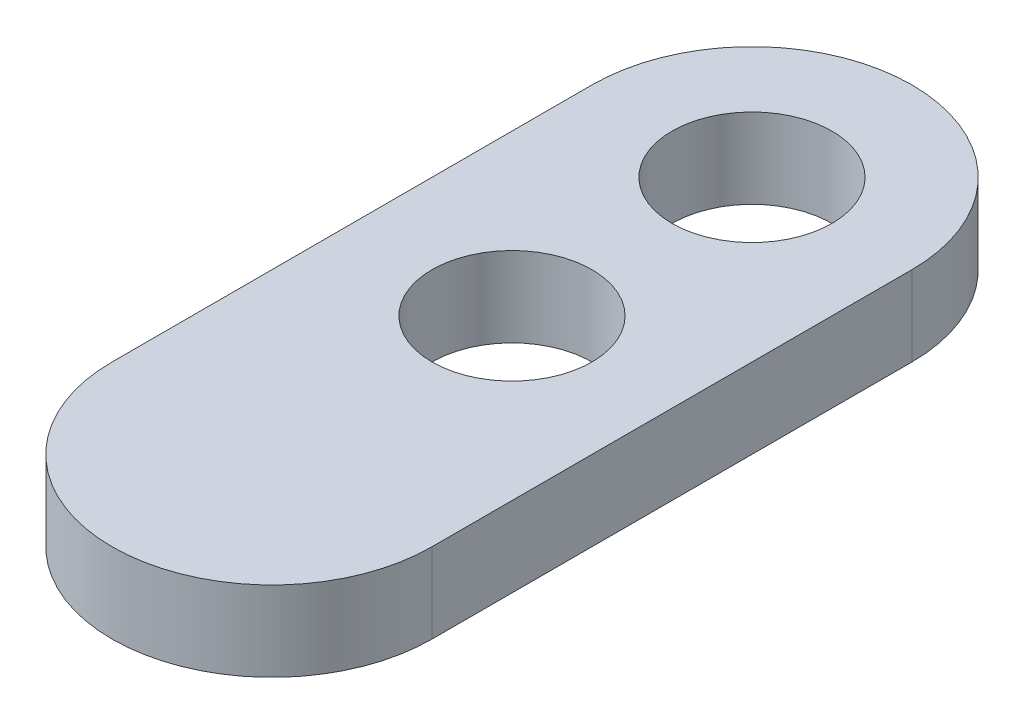
ISO-10303-21;
HEADER;
FILE_DESCRIPTION(('STEP AP214'),'2;1');
FILE_NAME('part.step','',(''),(''),'','','');
FILE_SCHEMA(('AUTOMOTIVE_DESIGN { 1 0 10303 214 1 1 1 1 }'));
ENDSEC;
DATA;
#1=APPLICATION_CONTEXT('core data for automotive mechanical design processes');
#2=APPLICATION_PROTOCOL_DEFINITION('international standard','automotive_design',2000,#1);
#3=PRODUCT_CONTEXT('',#1,'mechanical');
#4=PRODUCT('Part','Part','',(#3));
#5=PRODUCT_RELATED_PRODUCT_CATEGORY('part','',(#4));
#6=PRODUCT_DEFINITION_FORMATION('','',#4);
#7=PRODUCT_DEFINITION_CONTEXT('part definition',#1,'design');
#8=PRODUCT_DEFINITION('design','',#6,#7);
#9=PRODUCT_DEFINITION_SHAPE('','',#8);
#10=(LENGTH_UNIT() NAMED_UNIT(*) SI_UNIT(.MILLI.,.METRE.));
#11=(NAMED_UNIT(*) PLANE_ANGLE_UNIT() SI_UNIT($,.RADIAN.));
#12=(NAMED_UNIT(*) SI_UNIT($,.STERADIAN.) SOLID_ANGLE_UNIT());
#13=UNCERTAINTY_MEASURE_WITH_UNIT(LENGTH_MEASURE(1.E-05),#10,'distance_accuracy_value','');
#14=(GEOMETRIC_REPRESENTATION_CONTEXT(3) GLOBAL_UNCERTAINTY_ASSIGNED_CONTEXT((#13)) GLOBAL_UNIT_ASSIGNED_CONTEXT((#10,
#11,#12)) REPRESENTATION_CONTEXT('',''));
#15=CARTESIAN_POINT('',(0.,0.,0.));
#16=DIRECTION('',(0.,0.,1.));
#17=DIRECTION('',(1.,0.,0.));
#18=AXIS2_PLACEMENT_3D('',#15,#16,#17);
#19=CARTESIAN_POINT('',(0.,2.5,-7.5));
#20=DIRECTION('',(0.,-1.,0.));
#21=DIRECTION('',(0.,0.,-1.));
#22=AXIS2_PLACEMENT_3D('',#19,#20,#21);
#23=CYLINDRICAL_SURFACE('',#22,5.);
#24=CARTESIAN_POINT('',(0.,0.,-7.5));
#25=DIRECTION('',(0.,1.,0.));
#26=DIRECTION('',(0.,0.,1.));
#27=AXIS2_PLACEMENT_3D('',#24,#25,#26);
#28=CIRCLE('',#27,5.);
#29=CARTESIAN_POINT('',(-5.,0.,-7.5));
#30=VERTEX_POINT('',#29);
#31=CARTESIAN_POINT('',(5.,0.,-7.5));
#32=VERTEX_POINT('',#31);
#33=EDGE_CURVE('E99',#30,#32,#28,.F.);
#34=ORIENTED_EDGE('',*,*,#33,.F.);
#35=DIRECTION('',(0.,-1.,0.));
#36=VECTOR('',#35,1.);
#37=CARTESIAN_POINT('',(-5.,2.5,-7.5));
#38=LINE('',#37,#36);
#39=CARTESIAN_POINT('',(-5.,2.5,-7.5));
#40=VERTEX_POINT('',#39);
#41=EDGE_CURVE('E11',#40,#30,#38,.T.);
#42=ORIENTED_EDGE('',*,*,#41,.F.);
#43=CARTESIAN_POINT('',(0.,2.5,-7.5));
#44=DIRECTION('',(0.,1.,0.));
#45=DIRECTION('',(0.,0.,1.));
#46=AXIS2_PLACEMENT_3D('',#43,#44,#45);
#47=CIRCLE('',#46,5.);
#48=CARTESIAN_POINT('',(5.,2.5,-7.5));
#49=VERTEX_POINT('',#48);
#50=EDGE_CURVE('E92',#40,#49,#47,.F.);
#51=ORIENTED_EDGE('',*,*,#50,.T.);
#52=DIRECTION('',(0.,-1.,0.));
#53=VECTOR('',#52,1.);
#54=CARTESIAN_POINT('',(5.,2.5,-7.5));
#55=LINE('',#54,#53);
#56=EDGE_CURVE('E73',#49,#32,#55,.T.);
#57=ORIENTED_EDGE('',*,*,#56,.T.);
#58=EDGE_LOOP('',(#34,#42,#51,#57));
#59=FACE_BOUND('',#58,.T.);
#60=ADVANCED_FACE('F35',(#59),#23,.T.);
#61=CARTESIAN_POINT('',(-5.,2.5,0.));
#62=DIRECTION('',(-1.,0.,0.));
#63=DIRECTION('',(0.,0.,1.));
#64=AXIS2_PLACEMENT_3D('',#61,#62,#63);
#65=PLANE('',#64);
#66=DIRECTION('',(0.,0.,-1.));
#67=VECTOR('',#66,1.);
#68=CARTESIAN_POINT('',(-5.,0.,0.));
#69=LINE('',#68,#67);
#70=CARTESIAN_POINT('',(-5.,0.,7.5));
#71=VERTEX_POINT('',#70);
#72=EDGE_CURVE('E86',#71,#30,#69,.T.);
#73=ORIENTED_EDGE('',*,*,#72,.F.);
#74=DIRECTION('',(0.,-1.,0.));
#75=VECTOR('',#74,1.);
#76=CARTESIAN_POINT('',(-5.,2.5,7.5));
#77=LINE('',#76,#75);
#78=CARTESIAN_POINT('',(-5.,2.5,7.5));
#79=VERTEX_POINT('',#78);
#80=EDGE_CURVE('E43',#79,#71,#77,.T.);
#81=ORIENTED_EDGE('',*,*,#80,.F.);
#82=DIRECTION('',(0.,0.,-1.));
#83=VECTOR('',#82,1.);
#84=CARTESIAN_POINT('',(-5.,2.5,0.));
#85=LINE('',#84,#83);
#86=EDGE_CURVE('E84',#79,#40,#85,.T.);
#87=ORIENTED_EDGE('',*,*,#86,.T.);
#88=ORIENTED_EDGE('',*,*,#41,.T.);
#89=EDGE_LOOP('',(#73,#81,#87,#88));
#90=FACE_BOUND('',#89,.T.);
#91=ADVANCED_FACE('F82',(#90),#65,.T.);
#92=CARTESIAN_POINT('',(0.,2.5,7.5));
#93=DIRECTION('',(0.,-1.,0.));
#94=DIRECTION('',(0.,0.,-1.));
#95=AXIS2_PLACEMENT_3D('',#92,#93,#94);
#96=CYLINDRICAL_SURFACE('',#95,5.);
#97=CARTESIAN_POINT('',(0.,0.,7.5));
#98=DIRECTION('',(0.,1.,0.));
#99=DIRECTION('',(0.,0.,1.));
#100=AXIS2_PLACEMENT_3D('',#97,#98,#99);
#101=CIRCLE('',#100,5.);
#102=CARTESIAN_POINT('',(5.,0.,7.5));
#103=VERTEX_POINT('',#102);
#104=EDGE_CURVE('E66',#71,#103,#101,.T.);
#105=ORIENTED_EDGE('',*,*,#104,.T.);
#106=DIRECTION('',(0.,-1.,0.));
#107=VECTOR('',#106,1.);
#108=CARTESIAN_POINT('',(5.,2.5,7.5));
#109=LINE('',#108,#107);
#110=CARTESIAN_POINT('',(5.,2.5,7.5));
#111=VERTEX_POINT('',#110);
#112=EDGE_CURVE('E87',#111,#103,#109,.T.);
#113=ORIENTED_EDGE('',*,*,#112,.F.);
#114=CARTESIAN_POINT('',(0.,2.5,7.5));
#115=DIRECTION('',(0.,1.,0.));
#116=DIRECTION('',(0.,0.,1.));
#117=AXIS2_PLACEMENT_3D('',#114,#115,#116);
#118=CIRCLE('',#117,5.);
#119=EDGE_CURVE('E88',#79,#111,#118,.T.);
#120=ORIENTED_EDGE('',*,*,#119,.F.);
#121=ORIENTED_EDGE('',*,*,#80,.T.);
#122=EDGE_LOOP('',(#105,#113,#120,#121));
#123=FACE_BOUND('',#122,.T.);
#124=ADVANCED_FACE('F89',(#123),#96,.T.);
#125=CARTESIAN_POINT('',(5.,2.5,0.));
#126=DIRECTION('',(-1.,0.,0.));
#127=DIRECTION('',(0.,0.,1.));
#128=AXIS2_PLACEMENT_3D('',#125,#126,#127);
#129=PLANE('',#128);
#130=DIRECTION('',(0.,0.,-1.));
#131=VECTOR('',#130,1.);
#132=CARTESIAN_POINT('',(5.,0.,0.));
#133=LINE('',#132,#131);
#134=EDGE_CURVE('E94',#103,#32,#133,.T.);
#135=ORIENTED_EDGE('',*,*,#134,.T.);
#136=ORIENTED_EDGE('',*,*,#56,.F.);
#137=DIRECTION('',(0.,0.,-1.));
#138=VECTOR('',#137,1.);
#139=CARTESIAN_POINT('',(5.,2.5,0.));
#140=LINE('',#139,#138);
#141=EDGE_CURVE('E51',#111,#49,#140,.T.);
#142=ORIENTED_EDGE('',*,*,#141,.F.);
#143=ORIENTED_EDGE('',*,*,#112,.T.);
#144=EDGE_LOOP('',(#135,#136,#142,#143));
#145=FACE_BOUND('',#144,.T.);
#146=ADVANCED_FACE('F109',(#145),#129,.F.);
#147=CARTESIAN_POINT('',(0.,2.5,0.));
#148=DIRECTION('',(0.,1.,0.));
#149=DIRECTION('',(0.,0.,1.));
#150=AXIS2_PLACEMENT_3D('',#147,#148,#149);
#151=PLANE('',#150);
#152=CARTESIAN_POINT('',(0.,2.5,-7.5));
#153=DIRECTION('',(0.,1.,0.));
#154=DIRECTION('',(0.,0.,1.));
#155=AXIS2_PLACEMENT_3D('',#152,#153,#154);
#156=CIRCLE('',#155,2.5);
#157=CARTESIAN_POINT('',(0.,2.5,-5.));
#158=VERTEX_POINT('',#157);
#159=EDGE_CURVE('E141',#158,#158,#156,.T.);
#160=ORIENTED_EDGE('',*,*,#159,.F.);
#161=EDGE_LOOP('',(#160));
#162=FACE_BOUND('',#161,.T.);
#163=CARTESIAN_POINT('',(0.,2.5,0.));
#164=DIRECTION('',(0.,1.,0.));
#165=DIRECTION('',(0.,0.,1.));
#166=AXIS2_PLACEMENT_3D('',#163,#164,#165);
#167=CIRCLE('',#166,2.5);
#168=CARTESIAN_POINT('',(0.,2.5,2.5));
#169=VERTEX_POINT('',#168);
#170=EDGE_CURVE('E148',#169,#169,#167,.T.);
#171=ORIENTED_EDGE('',*,*,#170,.F.);
#172=EDGE_LOOP('',(#171));
#173=FACE_BOUND('',#172,.T.);
#174=ORIENTED_EDGE('',*,*,#50,.F.);
#175=ORIENTED_EDGE('',*,*,#86,.F.);
#176=ORIENTED_EDGE('',*,*,#119,.T.);
#177=ORIENTED_EDGE('',*,*,#141,.T.);
#178=EDGE_LOOP('',(#174,#175,#176,#177));
#179=FACE_BOUND('',#178,.T.);
#180=ADVANCED_FACE('F91',(#162,#173,#179),#151,.T.);
#181=CARTESIAN_POINT('',(0.,0.,0.));
#182=DIRECTION('',(0.,1.,0.));
#183=DIRECTION('',(0.,0.,1.));
#184=AXIS2_PLACEMENT_3D('',#181,#182,#183);
#185=PLANE('',#184);
#186=CARTESIAN_POINT('',(0.,0.,-7.5));
#187=DIRECTION('',(0.,1.,0.));
#188=DIRECTION('',(0.,0.,1.));
#189=AXIS2_PLACEMENT_3D('',#186,#187,#188);
#190=CIRCLE('',#189,2.5);
#191=CARTESIAN_POINT('',(0.,0.,-5.));
#192=VERTEX_POINT('',#191);
#193=EDGE_CURVE('E102',#192,#192,#190,.F.);
#194=ORIENTED_EDGE('',*,*,#193,.F.);
#195=EDGE_LOOP('',(#194));
#196=FACE_BOUND('',#195,.T.);
#197=CARTESIAN_POINT('',(0.,0.,0.));
#198=DIRECTION('',(0.,1.,0.));
#199=DIRECTION('',(0.,0.,1.));
#200=AXIS2_PLACEMENT_3D('',#197,#198,#199);
#201=CIRCLE('',#200,2.5);
#202=CARTESIAN_POINT('',(0.,0.,2.5));
#203=VERTEX_POINT('',#202);
#204=EDGE_CURVE('E145',#203,#203,#201,.F.);
#205=ORIENTED_EDGE('',*,*,#204,.F.);
#206=EDGE_LOOP('',(#205));
#207=FACE_BOUND('',#206,.T.);
#208=ORIENTED_EDGE('',*,*,#33,.T.);
#209=ORIENTED_EDGE('',*,*,#134,.F.);
#210=ORIENTED_EDGE('',*,*,#104,.F.);
#211=ORIENTED_EDGE('',*,*,#72,.T.);
#212=EDGE_LOOP('',(#208,#209,#210,#211));
#213=FACE_BOUND('',#212,.T.);
#214=ADVANCED_FACE('F111',(#196,#207,#213),#185,.F.);
#215=CARTESIAN_POINT('',(0.,-0.00100000000000013,0.));
#216=DIRECTION('',(0.,1.,0.));
#217=DIRECTION('',(0.,0.,1.));
#218=AXIS2_PLACEMENT_3D('',#215,#216,#217);
#219=CYLINDRICAL_SURFACE('',#218,2.5);
#220=ORIENTED_EDGE('',*,*,#170,.T.);
#221=EDGE_LOOP('',(#220));
#222=FACE_BOUND('',#221,.T.);
#223=ORIENTED_EDGE('',*,*,#204,.T.);
#224=EDGE_LOOP('',(#223));
#225=FACE_BOUND('',#224,.T.);
#226=ADVANCED_FACE('F125',(#222,#225),#219,.F.);
#227=CARTESIAN_POINT('',(0.,-0.00100000000000013,-7.5));
#228=DIRECTION('',(0.,1.,0.));
#229=DIRECTION('',(0.,0.,1.));
#230=AXIS2_PLACEMENT_3D('',#227,#228,#229);
#231=CYLINDRICAL_SURFACE('',#230,2.5);
#232=ORIENTED_EDGE('',*,*,#159,.T.);
#233=EDGE_LOOP('',(#232));
#234=FACE_BOUND('',#233,.T.);
#235=ORIENTED_EDGE('',*,*,#193,.T.);
#236=EDGE_LOOP('',(#235));
#237=FACE_BOUND('',#236,.T.);
#238=ADVANCED_FACE('F132',(#234,#237),#231,.F.);
#239=CLOSED_SHELL('',(#60,#91,#124,#146,#180,#214,#226,#238));
#240=MANIFOLD_SOLID_BREP('B2',#239);
#241=ADVANCED_BREP_SHAPE_REPRESENTATION('',(#18,#240),#14);
#242=SHAPE_DEFINITION_REPRESENTATION(#9,#241);
ENDSEC;
END-ISO-10303-21;
